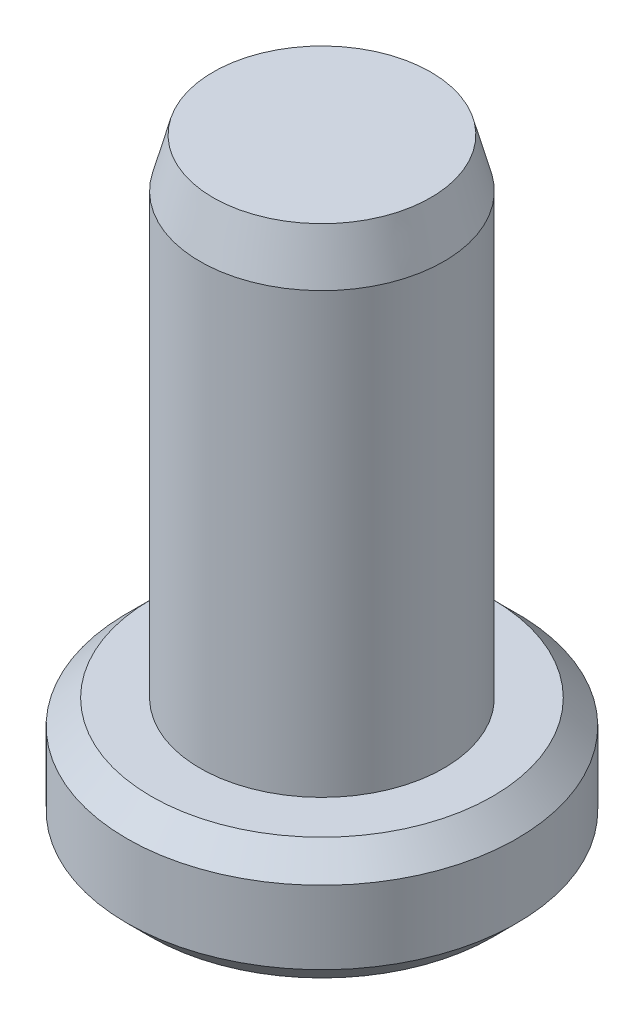
ISO-10303-21;
HEADER;
FILE_DESCRIPTION(('STEP AP214'),'2;1');
FILE_NAME('part.step','',(''),(''),'','','');
FILE_SCHEMA(('AUTOMOTIVE_DESIGN { 1 0 10303 214 1 1 1 1 }'));
ENDSEC;
DATA;
#1=APPLICATION_CONTEXT('core data for automotive mechanical design processes');
#2=APPLICATION_PROTOCOL_DEFINITION('international standard','automotive_design',2000,#1);
#3=PRODUCT_CONTEXT('',#1,'mechanical');
#4=PRODUCT('Part','Part','',(#3));
#5=PRODUCT_RELATED_PRODUCT_CATEGORY('part','',(#4));
#6=PRODUCT_DEFINITION_FORMATION('','',#4);
#7=PRODUCT_DEFINITION_CONTEXT('part definition',#1,'design');
#8=PRODUCT_DEFINITION('design','',#6,#7);
#9=PRODUCT_DEFINITION_SHAPE('','',#8);
#10=(LENGTH_UNIT() NAMED_UNIT(*) SI_UNIT(.MILLI.,.METRE.));
#11=(NAMED_UNIT(*) PLANE_ANGLE_UNIT() SI_UNIT($,.RADIAN.));
#12=(NAMED_UNIT(*) SI_UNIT($,.STERADIAN.) SOLID_ANGLE_UNIT());
#13=UNCERTAINTY_MEASURE_WITH_UNIT(LENGTH_MEASURE(1.E-05),#10,'distance_accuracy_value','');
#14=(GEOMETRIC_REPRESENTATION_CONTEXT(3) GLOBAL_UNCERTAINTY_ASSIGNED_CONTEXT((#13)) GLOBAL_UNIT_ASSIGNED_CONTEXT((#10,
#11,#12)) REPRESENTATION_CONTEXT('',''));
#15=CARTESIAN_POINT('',(0.,0.,0.));
#16=DIRECTION('',(0.,0.,1.));
#17=DIRECTION('',(1.,0.,0.));
#18=AXIS2_PLACEMENT_3D('',#15,#16,#17);
#19=CARTESIAN_POINT('',(0.,20.,0.));
#20=DIRECTION('',(0.,-1.,0.));
#21=DIRECTION('',(0.,0.,1.));
#22=AXIS2_PLACEMENT_3D('',#19,#20,#21);
#23=CYLINDRICAL_SURFACE('',#22,5.);
#24=CARTESIAN_POINT('',(0.,18.,0.));
#25=DIRECTION('',(0.,-1.,0.));
#26=DIRECTION('',(0.,0.,-1.));
#27=AXIS2_PLACEMENT_3D('',#24,#25,#26);
#28=CIRCLE('',#27,5.);
#29=CARTESIAN_POINT('',(0.,18.,-5.));
#30=VERTEX_POINT('',#29);
#31=EDGE_CURVE('E55',#30,#30,#28,.F.);
#32=ORIENTED_EDGE('',*,*,#31,.F.);
#33=EDGE_LOOP('',(#32));
#34=FACE_BOUND('',#33,.T.);
#35=CARTESIAN_POINT('',(0.,0.,0.));
#36=DIRECTION('',(0.,-1.,0.));
#37=DIRECTION('',(0.,0.,-1.));
#38=AXIS2_PLACEMENT_3D('',#35,#36,#37);
#39=CIRCLE('',#38,5.);
#40=CARTESIAN_POINT('',(0.,0.,-5.));
#41=VERTEX_POINT('',#40);
#42=EDGE_CURVE('E61',#41,#41,#39,.T.);
#43=ORIENTED_EDGE('',*,*,#42,.F.);
#44=EDGE_LOOP('',(#43));
#45=FACE_BOUND('',#44,.T.);
#46=ADVANCED_FACE('F35',(#34,#45),#23,.T.);
#47=CARTESIAN_POINT('',(0.,20.,0.));
#48=DIRECTION('',(0.,1.,0.));
#49=DIRECTION('',(0.,0.,-1.));
#50=AXIS2_PLACEMENT_3D('',#47,#48,#49);
#51=PLANE('',#50);
#52=CARTESIAN_POINT('',(0.,20.,0.));
#53=DIRECTION('',(0.,-1.,0.));
#54=DIRECTION('',(0.,0.,-1.));
#55=AXIS2_PLACEMENT_3D('',#52,#53,#54);
#56=CIRCLE('',#55,4.46410161513775);
#57=CARTESIAN_POINT('',(0.,20.,-4.46410161513775));
#58=VERTEX_POINT('',#57);
#59=EDGE_CURVE('E58',#58,#58,#56,.T.);
#60=ORIENTED_EDGE('',*,*,#59,.F.);
#61=EDGE_LOOP('',(#60));
#62=FACE_BOUND('',#61,.T.);
#63=ADVANCED_FACE('F68',(#62),#51,.T.);
#64=CARTESIAN_POINT('',(0.,20.,0.));
#65=DIRECTION('',(0.,-1.,0.));
#66=DIRECTION('',(0.,0.,1.));
#67=AXIS2_PLACEMENT_3D('',#64,#65,#66);
#68=CONICAL_SURFACE('',#67,4.46410161513775,0.261799387799146);
#69=ORIENTED_EDGE('',*,*,#31,.T.);
#70=EDGE_LOOP('',(#69));
#71=FACE_BOUND('',#70,.T.);
#72=ORIENTED_EDGE('',*,*,#59,.T.);
#73=EDGE_LOOP('',(#72));
#74=FACE_BOUND('',#73,.T.);
#75=ADVANCED_FACE('F74',(#71,#74),#68,.T.);
#76=CARTESIAN_POINT('',(0.,-5.,0.));
#77=DIRECTION('',(0.,1.,0.));
#78=DIRECTION('',(0.,0.,-1.));
#79=AXIS2_PLACEMENT_3D('',#76,#77,#78);
#80=CYLINDRICAL_SURFACE('',#79,8.);
#81=CARTESIAN_POINT('',(0.,-4.00000000000001,0.));
#82=DIRECTION('',(0.,1.,0.));
#83=DIRECTION('',(0.,0.,1.));
#84=AXIS2_PLACEMENT_3D('',#81,#82,#83);
#85=CIRCLE('',#84,8.);
#86=CARTESIAN_POINT('',(0.,-4.00000000000001,8.));
#87=VERTEX_POINT('',#86);
#88=EDGE_CURVE('E42',#87,#87,#85,.F.);
#89=ORIENTED_EDGE('',*,*,#88,.F.);
#90=EDGE_LOOP('',(#89));
#91=FACE_BOUND('',#90,.T.);
#92=CARTESIAN_POINT('',(0.,-0.999999999999997,0.));
#93=DIRECTION('',(0.,1.,0.));
#94=DIRECTION('',(0.,0.,1.));
#95=AXIS2_PLACEMENT_3D('',#92,#93,#94);
#96=CIRCLE('',#95,8.);
#97=CARTESIAN_POINT('',(0.,-0.999999999999997,8.));
#98=VERTEX_POINT('',#97);
#99=EDGE_CURVE('E46',#98,#98,#96,.T.);
#100=ORIENTED_EDGE('',*,*,#99,.F.);
#101=EDGE_LOOP('',(#100));
#102=FACE_BOUND('',#101,.T.);
#103=ADVANCED_FACE('F81',(#91,#102),#80,.T.);
#104=CARTESIAN_POINT('',(0.,-5.,0.));
#105=DIRECTION('',(0.,-1.,0.));
#106=DIRECTION('',(0.,0.,1.));
#107=AXIS2_PLACEMENT_3D('',#104,#105,#106);
#108=PLANE('',#107);
#109=CARTESIAN_POINT('',(0.,-5.,0.));
#110=DIRECTION('',(0.,1.,0.));
#111=DIRECTION('',(0.,0.,1.));
#112=AXIS2_PLACEMENT_3D('',#109,#110,#111);
#113=CIRCLE('',#112,7.00000000000001);
#114=CARTESIAN_POINT('',(0.,-5.,7.00000000000001));
#115=VERTEX_POINT('',#114);
#116=EDGE_CURVE('E50',#115,#115,#113,.T.);
#117=ORIENTED_EDGE('',*,*,#116,.F.);
#118=EDGE_LOOP('',(#117));
#119=FACE_BOUND('',#118,.T.);
#120=ADVANCED_FACE('F89',(#119),#108,.T.);
#121=CARTESIAN_POINT('',(0.,0.,0.));
#122=DIRECTION('',(0.,-1.,0.));
#123=DIRECTION('',(0.,0.,1.));
#124=AXIS2_PLACEMENT_3D('',#121,#122,#123);
#125=PLANE('',#124);
#126=CARTESIAN_POINT('',(0.,0.,0.));
#127=DIRECTION('',(0.,1.,0.));
#128=DIRECTION('',(0.,0.,1.));
#129=AXIS2_PLACEMENT_3D('',#126,#127,#128);
#130=CIRCLE('',#129,7.);
#131=CARTESIAN_POINT('',(0.,0.,7.));
#132=VERTEX_POINT('',#131);
#133=EDGE_CURVE('E10',#132,#132,#130,.F.);
#134=ORIENTED_EDGE('',*,*,#133,.F.);
#135=EDGE_LOOP('',(#134));
#136=FACE_BOUND('',#135,.T.);
#137=ORIENTED_EDGE('',*,*,#42,.T.);
#138=EDGE_LOOP('',(#137));
#139=FACE_BOUND('',#138,.T.);
#140=ADVANCED_FACE('F65',(#136,#139),#125,.F.);
#141=CARTESIAN_POINT('',(0.,-5.,0.));
#142=DIRECTION('',(0.,1.,0.));
#143=DIRECTION('',(0.,0.,-1.));
#144=AXIS2_PLACEMENT_3D('',#141,#142,#143);
#145=CONICAL_SURFACE('',#144,7.00000000000001,0.785398163397448);
#146=ORIENTED_EDGE('',*,*,#88,.T.);
#147=EDGE_LOOP('',(#146));
#148=FACE_BOUND('',#147,.T.);
#149=ORIENTED_EDGE('',*,*,#116,.T.);
#150=EDGE_LOOP('',(#149));
#151=FACE_BOUND('',#150,.T.);
#152=ADVANCED_FACE('F83',(#148,#151),#145,.T.);
#153=CARTESIAN_POINT('',(0.,-0.999999999999997,0.));
#154=DIRECTION('',(0.,-1.,0.));
#155=DIRECTION('',(0.,0.,1.));
#156=AXIS2_PLACEMENT_3D('',#153,#154,#155);
#157=CONICAL_SURFACE('',#156,8.,0.78539816339745);
#158=ORIENTED_EDGE('',*,*,#133,.T.);
#159=EDGE_LOOP('',(#158));
#160=FACE_BOUND('',#159,.T.);
#161=ORIENTED_EDGE('',*,*,#99,.T.);
#162=EDGE_LOOP('',(#161));
#163=FACE_BOUND('',#162,.T.);
#164=ADVANCED_FACE('F37',(#160,#163),#157,.T.);
#165=CLOSED_SHELL('',(#46,#63,#75,#103,#120,#140,#152,#164));
#166=MANIFOLD_SOLID_BREP('B2',#165);
#167=ADVANCED_BREP_SHAPE_REPRESENTATION('',(#18,#166),#14);
#168=SHAPE_DEFINITION_REPRESENTATION(#9,#167);
ENDSEC;
END-ISO-10303-21;
